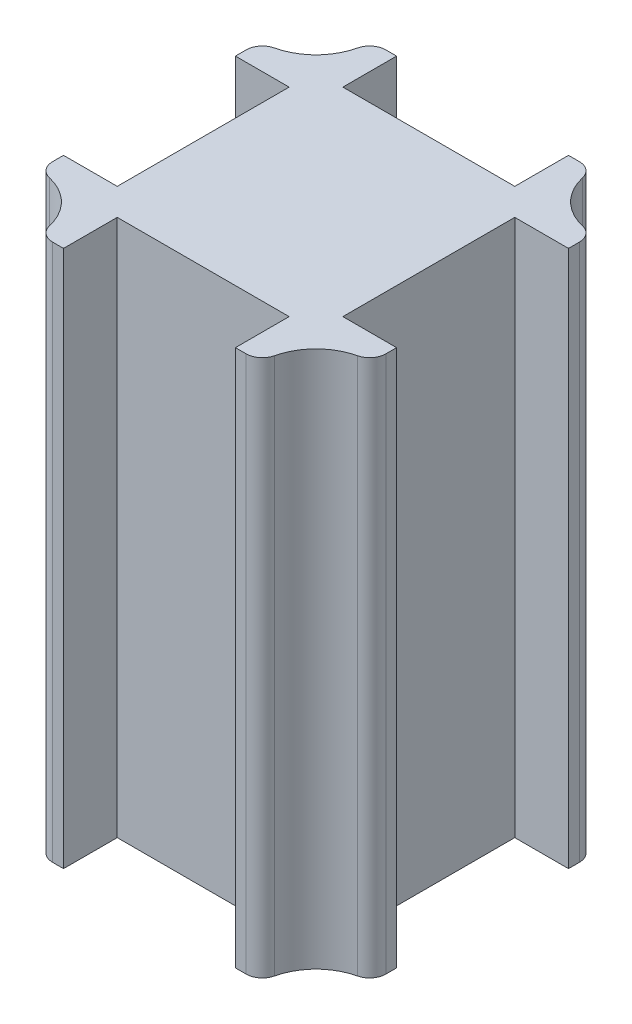
ISO-10303-21;
HEADER;
FILE_DESCRIPTION(('STEP AP214'),'2;1');
FILE_NAME('part.step','',(''),(''),'','','');
FILE_SCHEMA(('AUTOMOTIVE_DESIGN { 1 0 10303 214 1 1 1 1 }'));
ENDSEC;
DATA;
#1=APPLICATION_CONTEXT('core data for automotive mechanical design processes');
#2=APPLICATION_PROTOCOL_DEFINITION('international standard','automotive_design',2000,#1);
#3=PRODUCT_CONTEXT('',#1,'mechanical');
#4=PRODUCT('Part','Part','',(#3));
#5=PRODUCT_RELATED_PRODUCT_CATEGORY('part','',(#4));
#6=PRODUCT_DEFINITION_FORMATION('','',#4);
#7=PRODUCT_DEFINITION_CONTEXT('part definition',#1,'design');
#8=PRODUCT_DEFINITION('design','',#6,#7);
#9=PRODUCT_DEFINITION_SHAPE('','',#8);
#10=(LENGTH_UNIT() NAMED_UNIT(*) SI_UNIT(.MILLI.,.METRE.));
#11=(NAMED_UNIT(*) PLANE_ANGLE_UNIT() SI_UNIT($,.RADIAN.));
#12=(NAMED_UNIT(*) SI_UNIT($,.STERADIAN.) SOLID_ANGLE_UNIT());
#13=UNCERTAINTY_MEASURE_WITH_UNIT(LENGTH_MEASURE(1.E-05),#10,'distance_accuracy_value','');
#14=(GEOMETRIC_REPRESENTATION_CONTEXT(3) GLOBAL_UNCERTAINTY_ASSIGNED_CONTEXT((#13)) GLOBAL_UNIT_ASSIGNED_CONTEXT((#10,
#11,#12)) REPRESENTATION_CONTEXT('',''));
#15=CARTESIAN_POINT('',(0.,0.,0.));
#16=DIRECTION('',(0.,0.,1.));
#17=DIRECTION('',(1.,0.,0.));
#18=AXIS2_PLACEMENT_3D('',#15,#16,#17);
#19=CARTESIAN_POINT('',(15.5,53.,-15.5));
#20=DIRECTION('',(-1.,0.,0.));
#21=DIRECTION('',(0.,0.,1.));
#22=AXIS2_PLACEMENT_3D('',#19,#20,#21);
#23=PLANE('',#22);
#24=DIRECTION('',(0.,0.,-1.));
#25=VECTOR('',#24,1.);
#26=CARTESIAN_POINT('',(15.5,3.,-15.5));
#27=LINE('',#26,#25);
#28=CARTESIAN_POINT('',(15.5,3.,-8.00000000000019));
#29=VERTEX_POINT('',#28);
#30=CARTESIAN_POINT('',(15.5,3.,-9.00690631761515));
#31=VERTEX_POINT('',#30);
#32=EDGE_CURVE('E373',#29,#31,#27,.T.);
#33=ORIENTED_EDGE('',*,*,#32,.T.);
#34=DIRECTION('',(0.,1.,0.));
#35=VECTOR('',#34,1.);
#36=CARTESIAN_POINT('',(15.5,53.,-9.00690631761515));
#37=LINE('',#36,#35);
#38=CARTESIAN_POINT('',(15.5,53.,-9.00690631761515));
#39=VERTEX_POINT('',#38);
#40=EDGE_CURVE('E448',#31,#39,#37,.T.);
#41=ORIENTED_EDGE('',*,*,#40,.T.);
#42=DIRECTION('',(0.,0.,-1.));
#43=VECTOR('',#42,1.);
#44=CARTESIAN_POINT('',(15.5,53.,-15.5));
#45=LINE('',#44,#43);
#46=CARTESIAN_POINT('',(15.5,53.,-8.00000000000019));
#47=VERTEX_POINT('',#46);
#48=EDGE_CURVE('E259',#47,#39,#45,.T.);
#49=ORIENTED_EDGE('',*,*,#48,.F.);
#50=DIRECTION('',(0.,1.,0.));
#51=VECTOR('',#50,1.);
#52=CARTESIAN_POINT('',(15.5,3.,-8.00000000000019));
#53=LINE('',#52,#51);
#54=EDGE_CURVE('E325',#29,#47,#53,.T.);
#55=ORIENTED_EDGE('',*,*,#54,.F.);
#56=EDGE_LOOP('',(#33,#41,#49,#55));
#57=FACE_BOUND('',#56,.T.);
#58=ADVANCED_FACE('F39',(#57),#23,.F.);
#59=CARTESIAN_POINT('',(-15.5,53.,-15.5));
#60=DIRECTION('',(0.,0.,1.));
#61=DIRECTION('',(1.,0.,0.));
#62=AXIS2_PLACEMENT_3D('',#59,#60,#61);
#63=PLANE('',#62);
#64=DIRECTION('',(-1.,0.,0.));
#65=VECTOR('',#64,1.);
#66=CARTESIAN_POINT('',(-15.5,3.,-15.5));
#67=LINE('',#66,#65);
#68=CARTESIAN_POINT('',(-8.00000000000035,3.,-15.4999999999999));
#69=VERTEX_POINT('',#68);
#70=CARTESIAN_POINT('',(-9.00690631761527,3.,-15.5));
#71=VERTEX_POINT('',#70);
#72=EDGE_CURVE('E394',#69,#71,#67,.T.);
#73=ORIENTED_EDGE('',*,*,#72,.T.);
#74=DIRECTION('',(0.,1.,0.));
#75=VECTOR('',#74,1.);
#76=CARTESIAN_POINT('',(-9.00690631761527,53.,-15.5));
#77=LINE('',#76,#75);
#78=CARTESIAN_POINT('',(-9.00690631761527,53.,-15.5));
#79=VERTEX_POINT('',#78);
#80=EDGE_CURVE('E436',#71,#79,#77,.T.);
#81=ORIENTED_EDGE('',*,*,#80,.T.);
#82=DIRECTION('',(-1.,0.,0.));
#83=VECTOR('',#82,1.);
#84=CARTESIAN_POINT('',(-15.5,53.,-15.5));
#85=LINE('',#84,#83);
#86=CARTESIAN_POINT('',(-8.00000000000035,53.,-15.4999999999999));
#87=VERTEX_POINT('',#86);
#88=EDGE_CURVE('E385',#87,#79,#85,.T.);
#89=ORIENTED_EDGE('',*,*,#88,.F.);
#90=DIRECTION('',(0.,1.,0.));
#91=VECTOR('',#90,1.);
#92=CARTESIAN_POINT('',(-8.00000000000035,3.,-15.4999999999999));
#93=LINE('',#92,#91);
#94=EDGE_CURVE('E349',#69,#87,#93,.T.);
#95=ORIENTED_EDGE('',*,*,#94,.F.);
#96=EDGE_LOOP('',(#73,#81,#89,#95));
#97=FACE_BOUND('',#96,.T.);
#98=ADVANCED_FACE('F550',(#97),#63,.F.);
#99=CARTESIAN_POINT('',(-15.5,53.,15.5));
#100=DIRECTION('',(0.,0.,-1.));
#101=DIRECTION('',(-1.,0.,0.));
#102=AXIS2_PLACEMENT_3D('',#99,#100,#101);
#103=PLANE('',#102);
#104=DIRECTION('',(1.,0.,0.));
#105=VECTOR('',#104,1.);
#106=CARTESIAN_POINT('',(-15.5,3.,15.5));
#107=LINE('',#106,#105);
#108=CARTESIAN_POINT('',(8.00000000000024,3.,15.5));
#109=VERTEX_POINT('',#108);
#110=CARTESIAN_POINT('',(9.00690631761519,3.,15.5));
#111=VERTEX_POINT('',#110);
#112=EDGE_CURVE('E257',#109,#111,#107,.T.);
#113=ORIENTED_EDGE('',*,*,#112,.T.);
#114=DIRECTION('',(0.,1.,0.));
#115=VECTOR('',#114,1.);
#116=CARTESIAN_POINT('',(9.00690631761519,53.,15.5));
#117=LINE('',#116,#115);
#118=CARTESIAN_POINT('',(9.00690631761519,53.,15.5));
#119=VERTEX_POINT('',#118);
#120=EDGE_CURVE('E457',#111,#119,#117,.T.);
#121=ORIENTED_EDGE('',*,*,#120,.T.);
#122=DIRECTION('',(1.,0.,0.));
#123=VECTOR('',#122,1.);
#124=CARTESIAN_POINT('',(-15.5,53.,15.5));
#125=LINE('',#124,#123);
#126=CARTESIAN_POINT('',(8.00000000000024,53.,15.5));
#127=VERTEX_POINT('',#126);
#128=EDGE_CURVE('E389',#127,#119,#125,.T.);
#129=ORIENTED_EDGE('',*,*,#128,.F.);
#130=DIRECTION('',(0.,1.,0.));
#131=VECTOR('',#130,1.);
#132=CARTESIAN_POINT('',(8.00000000000024,3.,15.5));
#133=LINE('',#132,#131);
#134=EDGE_CURVE('E267',#109,#127,#133,.T.);
#135=ORIENTED_EDGE('',*,*,#134,.F.);
#136=EDGE_LOOP('',(#113,#121,#129,#135));
#137=FACE_BOUND('',#136,.T.);
#138=ADVANCED_FACE('F553',(#137),#103,.F.);
#139=CARTESIAN_POINT('',(-15.5,53.,-15.5));
#140=DIRECTION('',(1.,0.,0.));
#141=DIRECTION('',(0.,0.,-1.));
#142=AXIS2_PLACEMENT_3D('',#139,#140,#141);
#143=PLANE('',#142);
#144=DIRECTION('',(0.,0.,1.));
#145=VECTOR('',#144,1.);
#146=CARTESIAN_POINT('',(-15.5,3.,-15.5));
#147=LINE('',#146,#145);
#148=CARTESIAN_POINT('',(-15.5,3.,8.00000000000019));
#149=VERTEX_POINT('',#148);
#150=CARTESIAN_POINT('',(-15.5,3.,9.00690631761515));
#151=VERTEX_POINT('',#150);
#152=EDGE_CURVE('E399',#149,#151,#147,.T.);
#153=ORIENTED_EDGE('',*,*,#152,.T.);
#154=DIRECTION('',(0.,1.,0.));
#155=VECTOR('',#154,1.);
#156=CARTESIAN_POINT('',(-15.5,53.,9.00690631761515));
#157=LINE('',#156,#155);
#158=CARTESIAN_POINT('',(-15.5,53.,9.00690631761515));
#159=VERTEX_POINT('',#158);
#160=EDGE_CURVE('E11',#151,#159,#157,.T.);
#161=ORIENTED_EDGE('',*,*,#160,.T.);
#162=DIRECTION('',(0.,0.,1.));
#163=VECTOR('',#162,1.);
#164=CARTESIAN_POINT('',(-15.5,53.,-15.5));
#165=LINE('',#164,#163);
#166=CARTESIAN_POINT('',(-15.5,53.,8.00000000000019));
#167=VERTEX_POINT('',#166);
#168=EDGE_CURVE('E384',#167,#159,#165,.T.);
#169=ORIENTED_EDGE('',*,*,#168,.F.);
#170=DIRECTION('',(0.,1.,0.));
#171=VECTOR('',#170,1.);
#172=CARTESIAN_POINT('',(-15.5,3.,8.00000000000019));
#173=LINE('',#172,#171);
#174=EDGE_CURVE('E376',#149,#167,#173,.T.);
#175=ORIENTED_EDGE('',*,*,#174,.F.);
#176=EDGE_LOOP('',(#153,#161,#169,#175));
#177=FACE_BOUND('',#176,.T.);
#178=ADVANCED_FACE('F477',(#177),#143,.F.);
#179=CARTESIAN_POINT('',(15.5,53.,9.00690631761511));
#180=VERTEX_POINT('',#179);
#181=CARTESIAN_POINT('',(15.5,53.,8.));
#182=VERTEX_POINT('',#181);
#183=EDGE_CURVE('E379',#180,#182,#45,.T.);
#184=ORIENTED_EDGE('',*,*,#183,.F.);
#185=DIRECTION('',(0.,1.,0.));
#186=VECTOR('',#185,1.);
#187=CARTESIAN_POINT('',(15.5,53.,9.00690631761511));
#188=LINE('',#187,#186);
#189=CARTESIAN_POINT('',(15.5,3.,9.00690631761511));
#190=VERTEX_POINT('',#189);
#191=EDGE_CURVE('E449',#180,#190,#188,.F.);
#192=ORIENTED_EDGE('',*,*,#191,.T.);
#193=CARTESIAN_POINT('',(15.5,3.,8.));
#194=VERTEX_POINT('',#193);
#195=EDGE_CURVE('E395',#190,#194,#27,.T.);
#196=ORIENTED_EDGE('',*,*,#195,.T.);
#197=DIRECTION('',(0.,1.,0.));
#198=VECTOR('',#197,1.);
#199=CARTESIAN_POINT('',(15.5,3.,8.));
#200=LINE('',#199,#198);
#201=EDGE_CURVE('E310',#194,#182,#200,.T.);
#202=ORIENTED_EDGE('',*,*,#201,.T.);
#203=EDGE_LOOP('',(#184,#192,#196,#202));
#204=FACE_BOUND('',#203,.T.);
#205=ADVANCED_FACE('F549',(#204),#23,.F.);
#206=CARTESIAN_POINT('',(9.00690631761515,53.,-15.5));
#207=VERTEX_POINT('',#206);
#208=CARTESIAN_POINT('',(7.99999999999984,53.,-15.5000000000001));
#209=VERTEX_POINT('',#208);
#210=EDGE_CURVE('E382',#207,#209,#85,.T.);
#211=ORIENTED_EDGE('',*,*,#210,.F.);
#212=DIRECTION('',(0.,1.,0.));
#213=VECTOR('',#212,1.);
#214=CARTESIAN_POINT('',(9.00690631761515,53.,-15.5));
#215=LINE('',#214,#213);
#216=CARTESIAN_POINT('',(9.00690631761515,3.,-15.5));
#217=VERTEX_POINT('',#216);
#218=EDGE_CURVE('E438',#207,#217,#215,.F.);
#219=ORIENTED_EDGE('',*,*,#218,.T.);
#220=CARTESIAN_POINT('',(7.99999999999984,3.,-15.5000000000001));
#221=VERTEX_POINT('',#220);
#222=EDGE_CURVE('E392',#217,#221,#67,.T.);
#223=ORIENTED_EDGE('',*,*,#222,.T.);
#224=DIRECTION('',(0.,1.,0.));
#225=VECTOR('',#224,1.);
#226=CARTESIAN_POINT('',(7.99999999999984,3.,-15.5000000000001));
#227=LINE('',#226,#225);
#228=EDGE_CURVE('E338',#221,#209,#227,.T.);
#229=ORIENTED_EDGE('',*,*,#228,.T.);
#230=EDGE_LOOP('',(#211,#219,#223,#229));
#231=FACE_BOUND('',#230,.T.);
#232=ADVANCED_FACE('F556',(#231),#63,.F.);
#233=CARTESIAN_POINT('',(-15.5,53.,-9.00690631761502));
#234=VERTEX_POINT('',#233);
#235=CARTESIAN_POINT('',(-15.5,53.,-8.));
#236=VERTEX_POINT('',#235);
#237=EDGE_CURVE('E387',#234,#236,#165,.T.);
#238=ORIENTED_EDGE('',*,*,#237,.F.);
#239=DIRECTION('',(0.,1.,0.));
#240=VECTOR('',#239,1.);
#241=CARTESIAN_POINT('',(-15.5,53.,-9.00690631761502));
#242=LINE('',#241,#240);
#243=CARTESIAN_POINT('',(-15.5,3.,-9.00690631761502));
#244=VERTEX_POINT('',#243);
#245=EDGE_CURVE('E393',#234,#244,#242,.F.);
#246=ORIENTED_EDGE('',*,*,#245,.T.);
#247=CARTESIAN_POINT('',(-15.5,3.,-8.));
#248=VERTEX_POINT('',#247);
#249=EDGE_CURVE('E400',#244,#248,#147,.T.);
#250=ORIENTED_EDGE('',*,*,#249,.T.);
#251=DIRECTION('',(0.,1.,0.));
#252=VECTOR('',#251,1.);
#253=CARTESIAN_POINT('',(-15.5,3.,-8.));
#254=LINE('',#253,#252);
#255=EDGE_CURVE('E361',#248,#236,#254,.T.);
#256=ORIENTED_EDGE('',*,*,#255,.T.);
#257=EDGE_LOOP('',(#238,#246,#250,#256));
#258=FACE_BOUND('',#257,.T.);
#259=ADVANCED_FACE('F497',(#258),#143,.F.);
#260=CARTESIAN_POINT('',(-9.00690631761515,53.,15.5));
#261=VERTEX_POINT('',#260);
#262=CARTESIAN_POINT('',(-7.99999999999995,53.,15.5));
#263=VERTEX_POINT('',#262);
#264=EDGE_CURVE('E386',#261,#263,#125,.T.);
#265=ORIENTED_EDGE('',*,*,#264,.F.);
#266=DIRECTION('',(0.,1.,0.));
#267=VECTOR('',#266,1.);
#268=CARTESIAN_POINT('',(-9.00690631761515,53.,15.5));
#269=LINE('',#268,#267);
#270=CARTESIAN_POINT('',(-9.00690631761515,3.,15.5));
#271=VERTEX_POINT('',#270);
#272=EDGE_CURVE('E258',#261,#271,#269,.F.);
#273=ORIENTED_EDGE('',*,*,#272,.T.);
#274=CARTESIAN_POINT('',(-7.99999999999995,3.,15.5));
#275=VERTEX_POINT('',#274);
#276=EDGE_CURVE('E253',#271,#275,#107,.T.);
#277=ORIENTED_EDGE('',*,*,#276,.T.);
#278=DIRECTION('',(0.,1.,0.));
#279=VECTOR('',#278,1.);
#280=CARTESIAN_POINT('',(-7.99999999999995,3.,15.5));
#281=LINE('',#280,#279);
#282=EDGE_CURVE('E255',#275,#263,#281,.T.);
#283=ORIENTED_EDGE('',*,*,#282,.T.);
#284=EDGE_LOOP('',(#265,#273,#277,#283));
#285=FACE_BOUND('',#284,.T.);
#286=ADVANCED_FACE('F251',(#285),#103,.F.);
#287=CARTESIAN_POINT('',(0.,53.,0.));
#288=DIRECTION('',(0.,1.,0.));
#289=DIRECTION('',(0.,0.,1.));
#290=AXIS2_PLACEMENT_3D('',#287,#288,#289);
#291=PLANE('',#290);
#292=CARTESIAN_POINT('',(-15.5000000000002,53.,-15.4999999999998));
#293=DIRECTION('',(0.,1.,0.));
#294=DIRECTION('',(-1.,0.,0.));
#295=AXIS2_PLACEMENT_3D('',#292,#293,#294);
#296=CIRCLE('',#295,5.16410275792819);
#297=CARTESIAN_POINT('',(-14.3376298478176,53.,-10.4684144721809));
#298=VERTEX_POINT('',#297);
#299=CARTESIAN_POINT('',(-10.4684144721812,53.,-14.3376298478175));
#300=VERTEX_POINT('',#299);
#301=EDGE_CURVE('E506',#298,#300,#296,.T.);
#302=ORIENTED_EDGE('',*,*,#301,.F.);
#303=CARTESIAN_POINT('',(-14.,53.,-9.00690631761502));
#304=DIRECTION('',(0.,1.,0.));
#305=DIRECTION('',(0.,0.,1.));
#306=AXIS2_PLACEMENT_3D('',#303,#304,#305);
#307=CIRCLE('',#306,1.5);
#308=EDGE_CURVE('E432',#298,#234,#307,.T.);
#309=ORIENTED_EDGE('',*,*,#308,.T.);
#310=ORIENTED_EDGE('',*,*,#237,.T.);
#311=DIRECTION('',(-1.,0.,0.));
#312=VECTOR('',#311,1.);
#313=CARTESIAN_POINT('',(-15.5,53.,-8.));
#314=LINE('',#313,#312);
#315=CARTESIAN_POINT('',(-10.5000000000001,53.,-8.));
#316=VERTEX_POINT('',#315);
#317=EDGE_CURVE('E293',#316,#236,#314,.T.);
#318=ORIENTED_EDGE('',*,*,#317,.F.);
#319=DIRECTION('',(0.,0.,-1.));
#320=VECTOR('',#319,1.);
#321=CARTESIAN_POINT('',(-10.5000000000001,53.,-8.));
#322=LINE('',#321,#320);
#323=CARTESIAN_POINT('',(-10.5000000000001,53.,8.00000000000019));
#324=VERTEX_POINT('',#323);
#325=EDGE_CURVE('E359',#324,#316,#322,.T.);
#326=ORIENTED_EDGE('',*,*,#325,.F.);
#327=DIRECTION('',(1.,0.,0.));
#328=VECTOR('',#327,1.);
#329=CARTESIAN_POINT('',(-10.5000000000001,53.,8.00000000000019));
#330=LINE('',#329,#328);
#331=EDGE_CURVE('E368',#167,#324,#330,.T.);
#332=ORIENTED_EDGE('',*,*,#331,.F.);
#333=ORIENTED_EDGE('',*,*,#168,.T.);
#334=CARTESIAN_POINT('',(-14.,53.,9.00690631761515));
#335=DIRECTION('',(0.,1.,0.));
#336=DIRECTION('',(0.,0.,1.));
#337=AXIS2_PLACEMENT_3D('',#334,#335,#336);
#338=CIRCLE('',#337,1.5);
#339=CARTESIAN_POINT('',(-14.3376298478176,53.,10.4684144721811));
#340=VERTEX_POINT('',#339);
#341=EDGE_CURVE('E425',#159,#340,#338,.T.);
#342=ORIENTED_EDGE('',*,*,#341,.T.);
#343=CARTESIAN_POINT('',(-15.5,53.,15.5));
#344=DIRECTION('',(0.,1.,0.));
#345=DIRECTION('',(0.,0.,1.));
#346=AXIS2_PLACEMENT_3D('',#343,#344,#345);
#347=CIRCLE('',#346,5.16410275792819);
#348=CARTESIAN_POINT('',(-10.4684144721811,53.,14.3376298478176));
#349=VERTEX_POINT('',#348);
#350=EDGE_CURVE('E282',#349,#340,#347,.T.);
#351=ORIENTED_EDGE('',*,*,#350,.F.);
#352=CARTESIAN_POINT('',(-9.00690631761515,53.,14.));
#353=DIRECTION('',(0.,1.,0.));
#354=DIRECTION('',(0.,0.,1.));
#355=AXIS2_PLACEMENT_3D('',#352,#353,#354);
#356=CIRCLE('',#355,1.5);
#357=EDGE_CURVE('E65',#349,#261,#356,.T.);
#358=ORIENTED_EDGE('',*,*,#357,.T.);
#359=ORIENTED_EDGE('',*,*,#264,.T.);
#360=DIRECTION('',(0.,0.,1.));
#361=VECTOR('',#360,1.);
#362=CARTESIAN_POINT('',(-7.99999999999995,53.,15.5));
#363=LINE('',#362,#361);
#364=CARTESIAN_POINT('',(-7.99999999999996,53.,10.5000000000001));
#365=VERTEX_POINT('',#364);
#366=EDGE_CURVE('E268',#365,#263,#363,.T.);
#367=ORIENTED_EDGE('',*,*,#366,.F.);
#368=DIRECTION('',(-1.,0.,0.));
#369=VECTOR('',#368,1.);
#370=CARTESIAN_POINT('',(-7.99999999999996,53.,10.5000000000001));
#371=LINE('',#370,#369);
#372=CARTESIAN_POINT('',(8.00000000000022,53.,10.5000000000001));
#373=VERTEX_POINT('',#372);
#374=EDGE_CURVE('E279',#373,#365,#371,.T.);
#375=ORIENTED_EDGE('',*,*,#374,.F.);
#376=DIRECTION('',(0.,0.,-1.));
#377=VECTOR('',#376,1.);
#378=CARTESIAN_POINT('',(8.00000000000022,53.,10.5000000000001));
#379=LINE('',#378,#377);
#380=EDGE_CURVE('E285',#127,#373,#379,.T.);
#381=ORIENTED_EDGE('',*,*,#380,.F.);
#382=ORIENTED_EDGE('',*,*,#128,.T.);
#383=CARTESIAN_POINT('',(9.00690631761519,53.,14.));
#384=DIRECTION('',(0.,1.,0.));
#385=DIRECTION('',(0.,0.,1.));
#386=AXIS2_PLACEMENT_3D('',#383,#384,#385);
#387=CIRCLE('',#386,1.5);
#388=CARTESIAN_POINT('',(10.4684144721811,53.,14.3376298478176));
#389=VERTEX_POINT('',#388);
#390=EDGE_CURVE('E53',#119,#389,#387,.T.);
#391=ORIENTED_EDGE('',*,*,#390,.T.);
#392=CARTESIAN_POINT('',(15.5000000000001,53.,15.4999999999999));
#393=DIRECTION('',(0.,1.,0.));
#394=DIRECTION('',(1.,0.,0.));
#395=AXIS2_PLACEMENT_3D('',#392,#393,#394);
#396=CIRCLE('',#395,5.16410275792819);
#397=CARTESIAN_POINT('',(14.3376298478176,53.,10.468414472181));
#398=VERTEX_POINT('',#397);
#399=EDGE_CURVE('E523',#398,#389,#396,.T.);
#400=ORIENTED_EDGE('',*,*,#399,.F.);
#401=CARTESIAN_POINT('',(14.,53.,9.00690631761511));
#402=DIRECTION('',(0.,1.,0.));
#403=DIRECTION('',(0.,0.,1.));
#404=AXIS2_PLACEMENT_3D('',#401,#402,#403);
#405=CIRCLE('',#404,1.5);
#406=EDGE_CURVE('E426',#398,#180,#405,.T.);
#407=ORIENTED_EDGE('',*,*,#406,.T.);
#408=ORIENTED_EDGE('',*,*,#183,.T.);
#409=DIRECTION('',(1.,0.,0.));
#410=VECTOR('',#409,1.);
#411=CARTESIAN_POINT('',(15.5,53.,8.));
#412=LINE('',#411,#410);
#413=CARTESIAN_POINT('',(10.5000000000001,53.,8.));
#414=VERTEX_POINT('',#413);
#415=EDGE_CURVE('E309',#414,#182,#412,.T.);
#416=ORIENTED_EDGE('',*,*,#415,.F.);
#417=DIRECTION('',(0.,0.,1.));
#418=VECTOR('',#417,1.);
#419=CARTESIAN_POINT('',(10.5000000000001,53.,8.));
#420=LINE('',#419,#418);
#421=CARTESIAN_POINT('',(10.5000000000001,53.,-8.00000000000019));
#422=VERTEX_POINT('',#421);
#423=EDGE_CURVE('E305',#422,#414,#420,.T.);
#424=ORIENTED_EDGE('',*,*,#423,.F.);
#425=DIRECTION('',(-1.,0.,0.));
#426=VECTOR('',#425,1.);
#427=CARTESIAN_POINT('',(10.5000000000001,53.,-8.00000000000019));
#428=LINE('',#427,#426);
#429=EDGE_CURVE('E311',#47,#422,#428,.T.);
#430=ORIENTED_EDGE('',*,*,#429,.F.);
#431=ORIENTED_EDGE('',*,*,#48,.T.);
#432=CARTESIAN_POINT('',(14.,53.,-9.00690631761515));
#433=DIRECTION('',(0.,1.,0.));
#434=DIRECTION('',(0.,0.,1.));
#435=AXIS2_PLACEMENT_3D('',#432,#433,#434);
#436=CIRCLE('',#435,1.5);
#437=CARTESIAN_POINT('',(14.3376298478176,53.,-10.4684144721811));
#438=VERTEX_POINT('',#437);
#439=EDGE_CURVE('E428',#39,#438,#436,.T.);
#440=ORIENTED_EDGE('',*,*,#439,.T.);
#441=CARTESIAN_POINT('',(15.5,53.,-15.5));
#442=DIRECTION('',(0.,1.,0.));
#443=DIRECTION('',(0.,0.,-1.));
#444=AXIS2_PLACEMENT_3D('',#441,#442,#443);
#445=CIRCLE('',#444,5.16410275792819);
#446=CARTESIAN_POINT('',(10.4684144721811,53.,-14.3376298478176));
#447=VERTEX_POINT('',#446);
#448=EDGE_CURVE('E510',#447,#438,#445,.T.);
#449=ORIENTED_EDGE('',*,*,#448,.F.);
#450=CARTESIAN_POINT('',(9.00690631761515,53.,-14.));
#451=DIRECTION('',(0.,1.,0.));
#452=DIRECTION('',(0.,0.,1.));
#453=AXIS2_PLACEMENT_3D('',#450,#451,#452);
#454=CIRCLE('',#453,1.5);
#455=EDGE_CURVE('E429',#447,#207,#454,.T.);
#456=ORIENTED_EDGE('',*,*,#455,.T.);
#457=ORIENTED_EDGE('',*,*,#210,.T.);
#458=DIRECTION('',(0.,0.,-1.));
#459=VECTOR('',#458,1.);
#460=CARTESIAN_POINT('',(7.99999999999984,53.,-15.5000000000001));
#461=LINE('',#460,#459);
#462=CARTESIAN_POINT('',(7.99999999999989,53.,-10.5000000000002));
#463=VERTEX_POINT('',#462);
#464=EDGE_CURVE('E340',#463,#209,#461,.T.);
#465=ORIENTED_EDGE('',*,*,#464,.F.);
#466=DIRECTION('',(1.,0.,0.));
#467=VECTOR('',#466,1.);
#468=CARTESIAN_POINT('',(7.99999999999989,53.,-10.5000000000002));
#469=LINE('',#468,#467);
#470=CARTESIAN_POINT('',(-8.00000000000029,53.,-10.5));
#471=VERTEX_POINT('',#470);
#472=EDGE_CURVE('E329',#471,#463,#469,.T.);
#473=ORIENTED_EDGE('',*,*,#472,.F.);
#474=DIRECTION('',(0.,0.,1.));
#475=VECTOR('',#474,1.);
#476=CARTESIAN_POINT('',(-8.00000000000029,53.,-10.5));
#477=LINE('',#476,#475);
#478=EDGE_CURVE('E337',#87,#471,#477,.T.);
#479=ORIENTED_EDGE('',*,*,#478,.F.);
#480=ORIENTED_EDGE('',*,*,#88,.T.);
#481=CARTESIAN_POINT('',(-9.00690631761527,53.,-14.));
#482=DIRECTION('',(0.,1.,0.));
#483=DIRECTION('',(0.,0.,1.));
#484=AXIS2_PLACEMENT_3D('',#481,#482,#483);
#485=CIRCLE('',#484,1.5);
#486=EDGE_CURVE('E435',#79,#300,#485,.T.);
#487=ORIENTED_EDGE('',*,*,#486,.T.);
#488=EDGE_LOOP('',(#302,#309,#310,#318,#326,#332,#333,#342,#351,#358,#359,#367,#375,#381,#382,
#391,#400,#407,#408,#416,#424,#430,#431,#440,#449,#456,#457,#465,#473,#479,#480,#487));
#489=FACE_BOUND('',#488,.T.);
#490=ADVANCED_FACE('F466',(#489),#291,.T.);
#491=CARTESIAN_POINT('',(0.,3.,0.));
#492=DIRECTION('',(0.,1.,0.));
#493=DIRECTION('',(0.,0.,1.));
#494=AXIS2_PLACEMENT_3D('',#491,#492,#493);
#495=PLANE('',#494);
#496=CARTESIAN_POINT('',(0.,3.,0.));
#497=DIRECTION('',(0.,-1.,0.));
#498=DIRECTION('',(0.,0.,-1.));
#499=AXIS2_PLACEMENT_3D('',#496,#497,#498);
#500=CIRCLE('',#499,4.25);
#501=CARTESIAN_POINT('',(0.,3.,-4.25));
#502=VERTEX_POINT('',#501);
#503=EDGE_CURVE('E520',#502,#502,#500,.T.);
#504=ORIENTED_EDGE('',*,*,#503,.F.);
#505=EDGE_LOOP('',(#504));
#506=FACE_BOUND('',#505,.T.);
#507=ORIENTED_EDGE('',*,*,#249,.F.);
#508=CARTESIAN_POINT('',(-14.,3.,-9.00690631761502));
#509=DIRECTION('',(0.,1.,0.));
#510=DIRECTION('',(0.,0.,1.));
#511=AXIS2_PLACEMENT_3D('',#508,#509,#510);
#512=CIRCLE('',#511,1.5);
#513=CARTESIAN_POINT('',(-14.3376298478176,3.,-10.4684144721809));
#514=VERTEX_POINT('',#513);
#515=EDGE_CURVE('E418',#244,#514,#512,.F.);
#516=ORIENTED_EDGE('',*,*,#515,.T.);
#517=CARTESIAN_POINT('',(-15.5000000000002,3.,-15.4999999999998));
#518=DIRECTION('',(0.,1.,0.));
#519=DIRECTION('',(-1.,0.,0.));
#520=AXIS2_PLACEMENT_3D('',#517,#518,#519);
#521=CIRCLE('',#520,5.16410275792819);
#522=CARTESIAN_POINT('',(-10.4684144721812,3.,-14.3376298478175));
#523=VERTEX_POINT('',#522);
#524=EDGE_CURVE('E498',#514,#523,#521,.T.);
#525=ORIENTED_EDGE('',*,*,#524,.T.);
#526=CARTESIAN_POINT('',(-9.00690631761527,3.,-14.));
#527=DIRECTION('',(0.,1.,0.));
#528=DIRECTION('',(0.,0.,1.));
#529=AXIS2_PLACEMENT_3D('',#526,#527,#528);
#530=CIRCLE('',#529,1.5);
#531=EDGE_CURVE('E411',#523,#71,#530,.F.);
#532=ORIENTED_EDGE('',*,*,#531,.T.);
#533=ORIENTED_EDGE('',*,*,#72,.F.);
#534=DIRECTION('',(0.,0.,1.));
#535=VECTOR('',#534,1.);
#536=CARTESIAN_POINT('',(-8.00000000000029,3.,-10.5));
#537=LINE('',#536,#535);
#538=CARTESIAN_POINT('',(-8.00000000000029,3.,-10.5));
#539=VERTEX_POINT('',#538);
#540=EDGE_CURVE('E328',#69,#539,#537,.T.);
#541=ORIENTED_EDGE('',*,*,#540,.T.);
#542=DIRECTION('',(1.,0.,0.));
#543=VECTOR('',#542,1.);
#544=CARTESIAN_POINT('',(7.99999999999989,3.,-10.5000000000002));
#545=LINE('',#544,#543);
#546=CARTESIAN_POINT('',(7.99999999999989,3.,-10.5000000000002));
#547=VERTEX_POINT('',#546);
#548=EDGE_CURVE('E334',#539,#547,#545,.T.);
#549=ORIENTED_EDGE('',*,*,#548,.T.);
#550=DIRECTION('',(0.,0.,-1.));
#551=VECTOR('',#550,1.);
#552=CARTESIAN_POINT('',(7.99999999999984,3.,-15.5000000000001));
#553=LINE('',#552,#551);
#554=EDGE_CURVE('E326',#547,#221,#553,.T.);
#555=ORIENTED_EDGE('',*,*,#554,.T.);
#556=ORIENTED_EDGE('',*,*,#222,.F.);
#557=CARTESIAN_POINT('',(9.00690631761515,3.,-14.));
#558=DIRECTION('',(0.,1.,0.));
#559=DIRECTION('',(0.,0.,1.));
#560=AXIS2_PLACEMENT_3D('',#557,#558,#559);
#561=CIRCLE('',#560,1.5);
#562=CARTESIAN_POINT('',(10.4684144721811,3.,-14.3376298478176));
#563=VERTEX_POINT('',#562);
#564=EDGE_CURVE('E414',#217,#563,#561,.F.);
#565=ORIENTED_EDGE('',*,*,#564,.T.);
#566=CARTESIAN_POINT('',(15.5,3.,-15.5));
#567=DIRECTION('',(0.,1.,0.));
#568=DIRECTION('',(0.,0.,-1.));
#569=AXIS2_PLACEMENT_3D('',#566,#567,#568);
#570=CIRCLE('',#569,5.16410275792819);
#571=CARTESIAN_POINT('',(14.3376298478176,3.,-10.4684144721811));
#572=VERTEX_POINT('',#571);
#573=EDGE_CURVE('E524',#563,#572,#570,.T.);
#574=ORIENTED_EDGE('',*,*,#573,.T.);
#575=CARTESIAN_POINT('',(14.,3.,-9.00690631761515));
#576=DIRECTION('',(0.,1.,0.));
#577=DIRECTION('',(0.,0.,1.));
#578=AXIS2_PLACEMENT_3D('',#575,#576,#577);
#579=CIRCLE('',#578,1.5);
#580=EDGE_CURVE('E407',#572,#31,#579,.F.);
#581=ORIENTED_EDGE('',*,*,#580,.T.);
#582=ORIENTED_EDGE('',*,*,#32,.F.);
#583=DIRECTION('',(-1.,0.,0.));
#584=VECTOR('',#583,1.);
#585=CARTESIAN_POINT('',(10.5000000000001,3.,-8.00000000000019));
#586=LINE('',#585,#584);
#587=CARTESIAN_POINT('',(10.5000000000001,3.,-8.00000000000019));
#588=VERTEX_POINT('',#587);
#589=EDGE_CURVE('E304',#29,#588,#586,.T.);
#590=ORIENTED_EDGE('',*,*,#589,.T.);
#591=DIRECTION('',(0.,0.,1.));
#592=VECTOR('',#591,1.);
#593=CARTESIAN_POINT('',(10.5000000000001,3.,8.));
#594=LINE('',#593,#592);
#595=CARTESIAN_POINT('',(10.5000000000001,3.,8.));
#596=VERTEX_POINT('',#595);
#597=EDGE_CURVE('E308',#588,#596,#594,.T.);
#598=ORIENTED_EDGE('',*,*,#597,.T.);
#599=DIRECTION('',(1.,0.,0.));
#600=VECTOR('',#599,1.);
#601=CARTESIAN_POINT('',(15.5,3.,8.));
#602=LINE('',#601,#600);
#603=EDGE_CURVE('E299',#596,#194,#602,.T.);
#604=ORIENTED_EDGE('',*,*,#603,.T.);
#605=ORIENTED_EDGE('',*,*,#195,.F.);
#606=CARTESIAN_POINT('',(14.,3.,9.00690631761511));
#607=DIRECTION('',(0.,1.,0.));
#608=DIRECTION('',(0.,0.,1.));
#609=AXIS2_PLACEMENT_3D('',#606,#607,#608);
#610=CIRCLE('',#609,1.5);
#611=CARTESIAN_POINT('',(14.3376298478176,3.,10.468414472181));
#612=VERTEX_POINT('',#611);
#613=EDGE_CURVE('E406',#190,#612,#610,.F.);
#614=ORIENTED_EDGE('',*,*,#613,.T.);
#615=CARTESIAN_POINT('',(15.5000000000001,3.,15.4999999999999));
#616=DIRECTION('',(0.,1.,0.));
#617=DIRECTION('',(1.,0.,0.));
#618=AXIS2_PLACEMENT_3D('',#615,#616,#617);
#619=CIRCLE('',#618,5.16410275792819);
#620=CARTESIAN_POINT('',(10.4684144721811,3.,14.3376298478176));
#621=VERTEX_POINT('',#620);
#622=EDGE_CURVE('E473',#612,#621,#619,.T.);
#623=ORIENTED_EDGE('',*,*,#622,.T.);
#624=CARTESIAN_POINT('',(9.00690631761519,3.,14.));
#625=DIRECTION('',(0.,1.,0.));
#626=DIRECTION('',(0.,0.,1.));
#627=AXIS2_PLACEMENT_3D('',#624,#625,#626);
#628=CIRCLE('',#627,1.5);
#629=EDGE_CURVE('E408',#621,#111,#628,.F.);
#630=ORIENTED_EDGE('',*,*,#629,.T.);
#631=ORIENTED_EDGE('',*,*,#112,.F.);
#632=DIRECTION('',(0.,0.,-1.));
#633=VECTOR('',#632,1.);
#634=CARTESIAN_POINT('',(8.00000000000022,3.,10.5000000000001));
#635=LINE('',#634,#633);
#636=CARTESIAN_POINT('',(8.00000000000022,3.,10.5000000000001));
#637=VERTEX_POINT('',#636);
#638=EDGE_CURVE('E280',#109,#637,#635,.T.);
#639=ORIENTED_EDGE('',*,*,#638,.T.);
#640=DIRECTION('',(-1.,0.,0.));
#641=VECTOR('',#640,1.);
#642=CARTESIAN_POINT('',(-7.99999999999996,3.,10.5000000000001));
#643=LINE('',#642,#641);
#644=CARTESIAN_POINT('',(-7.99999999999996,3.,10.5000000000001));
#645=VERTEX_POINT('',#644);
#646=EDGE_CURVE('E269',#637,#645,#643,.T.);
#647=ORIENTED_EDGE('',*,*,#646,.T.);
#648=DIRECTION('',(0.,0.,1.));
#649=VECTOR('',#648,1.);
#650=CARTESIAN_POINT('',(-7.99999999999995,3.,15.5));
#651=LINE('',#650,#649);
#652=EDGE_CURVE('E264',#645,#275,#651,.T.);
#653=ORIENTED_EDGE('',*,*,#652,.T.);
#654=ORIENTED_EDGE('',*,*,#276,.F.);
#655=CARTESIAN_POINT('',(-9.00690631761515,3.,14.));
#656=DIRECTION('',(0.,1.,0.));
#657=DIRECTION('',(0.,0.,1.));
#658=AXIS2_PLACEMENT_3D('',#655,#656,#657);
#659=CIRCLE('',#658,1.5);
#660=CARTESIAN_POINT('',(-10.4684144721811,3.,14.3376298478176));
#661=VERTEX_POINT('',#660);
#662=EDGE_CURVE('E404',#271,#661,#659,.F.);
#663=ORIENTED_EDGE('',*,*,#662,.T.);
#664=CARTESIAN_POINT('',(-15.5,3.,15.5));
#665=DIRECTION('',(0.,1.,0.));
#666=DIRECTION('',(0.,0.,1.));
#667=AXIS2_PLACEMENT_3D('',#664,#665,#666);
#668=CIRCLE('',#667,5.16410275792819);
#669=CARTESIAN_POINT('',(-14.3376298478176,3.,10.4684144721811));
#670=VERTEX_POINT('',#669);
#671=EDGE_CURVE('E342',#661,#670,#668,.T.);
#672=ORIENTED_EDGE('',*,*,#671,.T.);
#673=CARTESIAN_POINT('',(-14.,3.,9.00690631761515));
#674=DIRECTION('',(0.,1.,0.));
#675=DIRECTION('',(0.,0.,1.));
#676=AXIS2_PLACEMENT_3D('',#673,#674,#675);
#677=CIRCLE('',#676,1.5);
#678=EDGE_CURVE('E405',#670,#151,#677,.F.);
#679=ORIENTED_EDGE('',*,*,#678,.T.);
#680=ORIENTED_EDGE('',*,*,#152,.F.);
#681=DIRECTION('',(1.,0.,0.));
#682=VECTOR('',#681,1.);
#683=CARTESIAN_POINT('',(-10.5000000000001,3.,8.00000000000019));
#684=LINE('',#683,#682);
#685=CARTESIAN_POINT('',(-10.5000000000001,3.,8.00000000000019));
#686=VERTEX_POINT('',#685);
#687=EDGE_CURVE('E357',#149,#686,#684,.T.);
#688=ORIENTED_EDGE('',*,*,#687,.T.);
#689=DIRECTION('',(0.,0.,-1.));
#690=VECTOR('',#689,1.);
#691=CARTESIAN_POINT('',(-10.5000000000001,3.,-8.));
#692=LINE('',#691,#690);
#693=CARTESIAN_POINT('',(-10.5000000000001,3.,-8.));
#694=VERTEX_POINT('',#693);
#695=EDGE_CURVE('E358',#686,#694,#692,.T.);
#696=ORIENTED_EDGE('',*,*,#695,.T.);
#697=DIRECTION('',(-1.,0.,0.));
#698=VECTOR('',#697,1.);
#699=CARTESIAN_POINT('',(-15.5,3.,-8.));
#700=LINE('',#699,#698);
#701=EDGE_CURVE('E351',#694,#248,#700,.T.);
#702=ORIENTED_EDGE('',*,*,#701,.T.);
#703=EDGE_LOOP('',(#507,#516,#525,#532,#533,#541,#549,#555,#556,#565,#574,#581,#582,#590,#598,
#604,#605,#614,#623,#630,#631,#639,#647,#653,#654,#663,#672,#679,#680,#688,#696,#702));
#704=FACE_BOUND('',#703,.T.);
#705=ADVANCED_FACE('F273',(#506,#704),#495,.F.);
#706=CARTESIAN_POINT('',(-15.5,3.,-8.));
#707=DIRECTION('',(0.,0.,-1.));
#708=DIRECTION('',(-1.,0.,0.));
#709=AXIS2_PLACEMENT_3D('',#706,#707,#708);
#710=PLANE('',#709);
#711=ORIENTED_EDGE('',*,*,#317,.T.);
#712=ORIENTED_EDGE('',*,*,#255,.F.);
#713=ORIENTED_EDGE('',*,*,#701,.F.);
#714=DIRECTION('',(0.,1.,0.));
#715=VECTOR('',#714,1.);
#716=CARTESIAN_POINT('',(-10.5000000000001,3.,-8.));
#717=LINE('',#716,#715);
#718=EDGE_CURVE('E371',#694,#316,#717,.T.);
#719=ORIENTED_EDGE('',*,*,#718,.T.);
#720=EDGE_LOOP('',(#711,#712,#713,#719));
#721=FACE_BOUND('',#720,.T.);
#722=ADVANCED_FACE('F495',(#721),#710,.F.);
#723=CARTESIAN_POINT('',(-10.5000000000001,3.,-8.));
#724=DIRECTION('',(1.,0.,0.));
#725=DIRECTION('',(0.,0.,-1.));
#726=AXIS2_PLACEMENT_3D('',#723,#724,#725);
#727=PLANE('',#726);
#728=ORIENTED_EDGE('',*,*,#325,.T.);
#729=ORIENTED_EDGE('',*,*,#718,.F.);
#730=ORIENTED_EDGE('',*,*,#695,.F.);
#731=DIRECTION('',(0.,1.,0.));
#732=VECTOR('',#731,1.);
#733=CARTESIAN_POINT('',(-10.5000000000001,3.,8.00000000000019));
#734=LINE('',#733,#732);
#735=EDGE_CURVE('E372',#686,#324,#734,.T.);
#736=ORIENTED_EDGE('',*,*,#735,.T.);
#737=EDGE_LOOP('',(#728,#729,#730,#736));
#738=FACE_BOUND('',#737,.T.);
#739=ADVANCED_FACE('F489',(#738),#727,.F.);
#740=CARTESIAN_POINT('',(-10.5000000000001,3.,8.00000000000019));
#741=DIRECTION('',(0.,0.,1.));
#742=DIRECTION('',(1.,0.,0.));
#743=AXIS2_PLACEMENT_3D('',#740,#741,#742);
#744=PLANE('',#743);
#745=ORIENTED_EDGE('',*,*,#331,.T.);
#746=ORIENTED_EDGE('',*,*,#735,.F.);
#747=ORIENTED_EDGE('',*,*,#687,.F.);
#748=ORIENTED_EDGE('',*,*,#174,.T.);
#749=EDGE_LOOP('',(#745,#746,#747,#748));
#750=FACE_BOUND('',#749,.T.);
#751=ADVANCED_FACE('F486',(#750),#744,.F.);
#752=CARTESIAN_POINT('',(7.99999999999984,3.,-15.5000000000001));
#753=DIRECTION('',(1.,0.,0.));
#754=DIRECTION('',(0.,0.,-1.));
#755=AXIS2_PLACEMENT_3D('',#752,#753,#754);
#756=PLANE('',#755);
#757=ORIENTED_EDGE('',*,*,#464,.T.);
#758=ORIENTED_EDGE('',*,*,#228,.F.);
#759=ORIENTED_EDGE('',*,*,#554,.F.);
#760=DIRECTION('',(0.,1.,0.));
#761=VECTOR('',#760,1.);
#762=CARTESIAN_POINT('',(7.99999999999989,3.,-10.5000000000002));
#763=LINE('',#762,#761);
#764=EDGE_CURVE('E314',#547,#463,#763,.T.);
#765=ORIENTED_EDGE('',*,*,#764,.T.);
#766=EDGE_LOOP('',(#757,#758,#759,#765));
#767=FACE_BOUND('',#766,.T.);
#768=ADVANCED_FACE('F625',(#767),#756,.F.);
#769=CARTESIAN_POINT('',(7.99999999999989,3.,-10.5000000000002));
#770=DIRECTION('',(0.,0.,1.));
#771=DIRECTION('',(1.,0.,0.));
#772=AXIS2_PLACEMENT_3D('',#769,#770,#771);
#773=PLANE('',#772);
#774=ORIENTED_EDGE('',*,*,#472,.T.);
#775=ORIENTED_EDGE('',*,*,#764,.F.);
#776=ORIENTED_EDGE('',*,*,#548,.F.);
#777=DIRECTION('',(0.,1.,0.));
#778=VECTOR('',#777,1.);
#779=CARTESIAN_POINT('',(-8.00000000000029,3.,-10.5));
#780=LINE('',#779,#778);
#781=EDGE_CURVE('E350',#539,#471,#780,.T.);
#782=ORIENTED_EDGE('',*,*,#781,.T.);
#783=EDGE_LOOP('',(#774,#775,#776,#782));
#784=FACE_BOUND('',#783,.T.);
#785=ADVANCED_FACE('F616',(#784),#773,.F.);
#786=CARTESIAN_POINT('',(-8.00000000000029,3.,-10.5));
#787=DIRECTION('',(-1.,0.,0.));
#788=DIRECTION('',(0.,0.,1.));
#789=AXIS2_PLACEMENT_3D('',#786,#787,#788);
#790=PLANE('',#789);
#791=ORIENTED_EDGE('',*,*,#478,.T.);
#792=ORIENTED_EDGE('',*,*,#781,.F.);
#793=ORIENTED_EDGE('',*,*,#540,.F.);
#794=ORIENTED_EDGE('',*,*,#94,.T.);
#795=EDGE_LOOP('',(#791,#792,#793,#794));
#796=FACE_BOUND('',#795,.T.);
#797=ADVANCED_FACE('F619',(#796),#790,.F.);
#798=CARTESIAN_POINT('',(15.5,3.,8.));
#799=DIRECTION('',(0.,0.,1.));
#800=DIRECTION('',(1.,0.,0.));
#801=AXIS2_PLACEMENT_3D('',#798,#799,#800);
#802=PLANE('',#801);
#803=ORIENTED_EDGE('',*,*,#415,.T.);
#804=ORIENTED_EDGE('',*,*,#201,.F.);
#805=ORIENTED_EDGE('',*,*,#603,.F.);
#806=DIRECTION('',(0.,1.,0.));
#807=VECTOR('',#806,1.);
#808=CARTESIAN_POINT('',(10.5000000000001,3.,8.));
#809=LINE('',#808,#807);
#810=EDGE_CURVE('E288',#596,#414,#809,.T.);
#811=ORIENTED_EDGE('',*,*,#810,.T.);
#812=EDGE_LOOP('',(#803,#804,#805,#811));
#813=FACE_BOUND('',#812,.T.);
#814=ADVANCED_FACE('F608',(#813),#802,.F.);
#815=CARTESIAN_POINT('',(10.5000000000001,3.,8.));
#816=DIRECTION('',(-1.,0.,0.));
#817=DIRECTION('',(0.,0.,1.));
#818=AXIS2_PLACEMENT_3D('',#815,#816,#817);
#819=PLANE('',#818);
#820=ORIENTED_EDGE('',*,*,#423,.T.);
#821=ORIENTED_EDGE('',*,*,#810,.F.);
#822=ORIENTED_EDGE('',*,*,#597,.F.);
#823=DIRECTION('',(0.,1.,0.));
#824=VECTOR('',#823,1.);
#825=CARTESIAN_POINT('',(10.5000000000001,3.,-8.00000000000019));
#826=LINE('',#825,#824);
#827=EDGE_CURVE('E319',#588,#422,#826,.T.);
#828=ORIENTED_EDGE('',*,*,#827,.T.);
#829=EDGE_LOOP('',(#820,#821,#822,#828));
#830=FACE_BOUND('',#829,.T.);
#831=ADVANCED_FACE('F610',(#830),#819,.F.);
#832=CARTESIAN_POINT('',(10.5000000000001,3.,-8.00000000000019));
#833=DIRECTION('',(0.,0.,-1.));
#834=DIRECTION('',(-1.,0.,0.));
#835=AXIS2_PLACEMENT_3D('',#832,#833,#834);
#836=PLANE('',#835);
#837=ORIENTED_EDGE('',*,*,#429,.T.);
#838=ORIENTED_EDGE('',*,*,#827,.F.);
#839=ORIENTED_EDGE('',*,*,#589,.F.);
#840=ORIENTED_EDGE('',*,*,#54,.T.);
#841=EDGE_LOOP('',(#837,#838,#839,#840));
#842=FACE_BOUND('',#841,.T.);
#843=ADVANCED_FACE('F605',(#842),#836,.F.);
#844=CARTESIAN_POINT('',(-7.99999999999995,3.,15.5));
#845=DIRECTION('',(-1.,0.,0.));
#846=DIRECTION('',(0.,0.,1.));
#847=AXIS2_PLACEMENT_3D('',#844,#845,#846);
#848=PLANE('',#847);
#849=ORIENTED_EDGE('',*,*,#366,.T.);
#850=ORIENTED_EDGE('',*,*,#282,.F.);
#851=ORIENTED_EDGE('',*,*,#652,.F.);
#852=DIRECTION('',(0.,1.,0.));
#853=VECTOR('',#852,1.);
#854=CARTESIAN_POINT('',(-7.99999999999996,3.,10.5000000000001));
#855=LINE('',#854,#853);
#856=EDGE_CURVE('E291',#645,#365,#855,.T.);
#857=ORIENTED_EDGE('',*,*,#856,.T.);
#858=EDGE_LOOP('',(#849,#850,#851,#857));
#859=FACE_BOUND('',#858,.T.);
#860=ADVANCED_FACE('F262',(#859),#848,.F.);
#861=CARTESIAN_POINT('',(-7.99999999999996,3.,10.5000000000001));
#862=DIRECTION('',(0.,0.,-1.));
#863=DIRECTION('',(-1.,0.,0.));
#864=AXIS2_PLACEMENT_3D('',#861,#862,#863);
#865=PLANE('',#864);
#866=ORIENTED_EDGE('',*,*,#374,.T.);
#867=ORIENTED_EDGE('',*,*,#856,.F.);
#868=ORIENTED_EDGE('',*,*,#646,.F.);
#869=DIRECTION('',(0.,1.,0.));
#870=VECTOR('',#869,1.);
#871=CARTESIAN_POINT('',(8.00000000000022,3.,10.5000000000001));
#872=LINE('',#871,#870);
#873=EDGE_CURVE('E298',#637,#373,#872,.T.);
#874=ORIENTED_EDGE('',*,*,#873,.T.);
#875=EDGE_LOOP('',(#866,#867,#868,#874));
#876=FACE_BOUND('',#875,.T.);
#877=ADVANCED_FACE('F594',(#876),#865,.F.);
#878=CARTESIAN_POINT('',(8.00000000000022,3.,10.5000000000001));
#879=DIRECTION('',(1.,0.,0.));
#880=DIRECTION('',(0.,0.,-1.));
#881=AXIS2_PLACEMENT_3D('',#878,#879,#880);
#882=PLANE('',#881);
#883=ORIENTED_EDGE('',*,*,#380,.T.);
#884=ORIENTED_EDGE('',*,*,#873,.F.);
#885=ORIENTED_EDGE('',*,*,#638,.F.);
#886=ORIENTED_EDGE('',*,*,#134,.T.);
#887=EDGE_LOOP('',(#883,#884,#885,#886));
#888=FACE_BOUND('',#887,.T.);
#889=ADVANCED_FACE('F595',(#888),#882,.F.);
#890=CARTESIAN_POINT('',(-15.5,3.,15.5));
#891=DIRECTION('',(0.,1.,0.));
#892=DIRECTION('',(0.,0.,1.));
#893=AXIS2_PLACEMENT_3D('',#890,#891,#892);
#894=CYLINDRICAL_SURFACE('',#893,5.16410275792819);
#895=ORIENTED_EDGE('',*,*,#671,.F.);
#896=DIRECTION('',(0.,1.,0.));
#897=VECTOR('',#896,1.);
#898=CARTESIAN_POINT('',(-10.4684144721811,3.,14.3376298478176));
#899=LINE('',#898,#897);
#900=EDGE_CURVE('E50',#661,#349,#899,.T.);
#901=ORIENTED_EDGE('',*,*,#900,.T.);
#902=ORIENTED_EDGE('',*,*,#350,.T.);
#903=DIRECTION('',(0.,1.,0.));
#904=VECTOR('',#903,1.);
#905=CARTESIAN_POINT('',(-14.3376298478176,3.,10.4684144721811));
#906=LINE('',#905,#904);
#907=EDGE_CURVE('E459',#340,#670,#906,.F.);
#908=ORIENTED_EDGE('',*,*,#907,.T.);
#909=EDGE_LOOP('',(#895,#901,#902,#908));
#910=FACE_BOUND('',#909,.T.);
#911=ADVANCED_FACE('F464',(#910),#894,.F.);
#912=CARTESIAN_POINT('',(-15.5000000000002,3.,-15.4999999999998));
#913=DIRECTION('',(0.,1.,0.));
#914=DIRECTION('',(0.,0.,1.));
#915=AXIS2_PLACEMENT_3D('',#912,#913,#914);
#916=CYLINDRICAL_SURFACE('',#915,5.16410275792819);
#917=ORIENTED_EDGE('',*,*,#524,.F.);
#918=DIRECTION('',(0.,1.,0.));
#919=VECTOR('',#918,1.);
#920=CARTESIAN_POINT('',(-14.3376298478176,3.,-10.4684144721809));
#921=LINE('',#920,#919);
#922=EDGE_CURVE('E419',#514,#298,#921,.T.);
#923=ORIENTED_EDGE('',*,*,#922,.T.);
#924=ORIENTED_EDGE('',*,*,#301,.T.);
#925=DIRECTION('',(0.,1.,0.));
#926=VECTOR('',#925,1.);
#927=CARTESIAN_POINT('',(-10.4684144721812,3.,-14.3376298478175));
#928=LINE('',#927,#926);
#929=EDGE_CURVE('E416',#300,#523,#928,.F.);
#930=ORIENTED_EDGE('',*,*,#929,.T.);
#931=EDGE_LOOP('',(#917,#923,#924,#930));
#932=FACE_BOUND('',#931,.T.);
#933=ADVANCED_FACE('F502',(#932),#916,.F.);
#934=CARTESIAN_POINT('',(15.5,3.,-15.5));
#935=DIRECTION('',(0.,1.,0.));
#936=DIRECTION('',(0.,0.,1.));
#937=AXIS2_PLACEMENT_3D('',#934,#935,#936);
#938=CYLINDRICAL_SURFACE('',#937,5.16410275792819);
#939=ORIENTED_EDGE('',*,*,#573,.F.);
#940=DIRECTION('',(0.,1.,0.));
#941=VECTOR('',#940,1.);
#942=CARTESIAN_POINT('',(10.4684144721811,3.,-14.3376298478176));
#943=LINE('',#942,#941);
#944=EDGE_CURVE('E441',#563,#447,#943,.T.);
#945=ORIENTED_EDGE('',*,*,#944,.T.);
#946=ORIENTED_EDGE('',*,*,#448,.T.);
#947=DIRECTION('',(0.,1.,0.));
#948=VECTOR('',#947,1.);
#949=CARTESIAN_POINT('',(14.3376298478176,3.,-10.4684144721811));
#950=LINE('',#949,#948);
#951=EDGE_CURVE('E445',#438,#572,#950,.F.);
#952=ORIENTED_EDGE('',*,*,#951,.T.);
#953=EDGE_LOOP('',(#939,#945,#946,#952));
#954=FACE_BOUND('',#953,.T.);
#955=ADVANCED_FACE('F701',(#954),#938,.F.);
#956=CARTESIAN_POINT('',(15.5000000000001,3.,15.4999999999999));
#957=DIRECTION('',(0.,1.,0.));
#958=DIRECTION('',(0.,0.,1.));
#959=AXIS2_PLACEMENT_3D('',#956,#957,#958);
#960=CYLINDRICAL_SURFACE('',#959,5.16410275792819);
#961=ORIENTED_EDGE('',*,*,#622,.F.);
#962=DIRECTION('',(0.,1.,0.));
#963=VECTOR('',#962,1.);
#964=CARTESIAN_POINT('',(14.3376298478176,3.,10.468414472181));
#965=LINE('',#964,#963);
#966=EDGE_CURVE('E451',#612,#398,#965,.T.);
#967=ORIENTED_EDGE('',*,*,#966,.T.);
#968=ORIENTED_EDGE('',*,*,#399,.T.);
#969=DIRECTION('',(0.,1.,0.));
#970=VECTOR('',#969,1.);
#971=CARTESIAN_POINT('',(10.4684144721811,3.,14.3376298478176));
#972=LINE('',#971,#970);
#973=EDGE_CURVE('E454',#389,#621,#972,.F.);
#974=ORIENTED_EDGE('',*,*,#973,.T.);
#975=EDGE_LOOP('',(#961,#967,#968,#974));
#976=FACE_BOUND('',#975,.T.);
#977=ADVANCED_FACE('F583',(#976),#960,.F.);
#978=CARTESIAN_POINT('',(-14.,3.,-9.00690631761502));
#979=DIRECTION('',(0.,1.,0.));
#980=DIRECTION('',(0.,0.,1.));
#981=AXIS2_PLACEMENT_3D('',#978,#979,#980);
#982=CYLINDRICAL_SURFACE('',#981,1.5);
#983=ORIENTED_EDGE('',*,*,#308,.F.);
#984=ORIENTED_EDGE('',*,*,#922,.F.);
#985=ORIENTED_EDGE('',*,*,#515,.F.);
#986=ORIENTED_EDGE('',*,*,#245,.F.);
#987=EDGE_LOOP('',(#983,#984,#985,#986));
#988=FACE_BOUND('',#987,.T.);
#989=ADVANCED_FACE('F515',(#988),#982,.T.);
#990=CARTESIAN_POINT('',(-9.00690631761527,3.,-14.));
#991=DIRECTION('',(0.,1.,0.));
#992=DIRECTION('',(0.,0.,1.));
#993=AXIS2_PLACEMENT_3D('',#990,#991,#992);
#994=CYLINDRICAL_SURFACE('',#993,1.5);
#995=ORIENTED_EDGE('',*,*,#531,.F.);
#996=ORIENTED_EDGE('',*,*,#929,.F.);
#997=ORIENTED_EDGE('',*,*,#486,.F.);
#998=ORIENTED_EDGE('',*,*,#80,.F.);
#999=EDGE_LOOP('',(#995,#996,#997,#998));
#1000=FACE_BOUND('',#999,.T.);
#1001=ADVANCED_FACE('F727',(#1000),#994,.T.);
#1002=CARTESIAN_POINT('',(9.00690631761515,3.,-14.));
#1003=DIRECTION('',(0.,1.,0.));
#1004=DIRECTION('',(0.,0.,1.));
#1005=AXIS2_PLACEMENT_3D('',#1002,#1003,#1004);
#1006=CYLINDRICAL_SURFACE('',#1005,1.5);
#1007=ORIENTED_EDGE('',*,*,#455,.F.);
#1008=ORIENTED_EDGE('',*,*,#944,.F.);
#1009=ORIENTED_EDGE('',*,*,#564,.F.);
#1010=ORIENTED_EDGE('',*,*,#218,.F.);
#1011=EDGE_LOOP('',(#1007,#1008,#1009,#1010));
#1012=FACE_BOUND('',#1011,.T.);
#1013=ADVANCED_FACE('F734',(#1012),#1006,.T.);
#1014=CARTESIAN_POINT('',(14.,3.,-9.00690631761515));
#1015=DIRECTION('',(0.,1.,0.));
#1016=DIRECTION('',(0.,0.,1.));
#1017=AXIS2_PLACEMENT_3D('',#1014,#1015,#1016);
#1018=CYLINDRICAL_SURFACE('',#1017,1.5);
#1019=ORIENTED_EDGE('',*,*,#580,.F.);
#1020=ORIENTED_EDGE('',*,*,#951,.F.);
#1021=ORIENTED_EDGE('',*,*,#439,.F.);
#1022=ORIENTED_EDGE('',*,*,#40,.F.);
#1023=EDGE_LOOP('',(#1019,#1020,#1021,#1022));
#1024=FACE_BOUND('',#1023,.T.);
#1025=ADVANCED_FACE('F741',(#1024),#1018,.T.);
#1026=CARTESIAN_POINT('',(14.,3.,9.00690631761511));
#1027=DIRECTION('',(0.,1.,0.));
#1028=DIRECTION('',(0.,0.,1.));
#1029=AXIS2_PLACEMENT_3D('',#1026,#1027,#1028);
#1030=CYLINDRICAL_SURFACE('',#1029,1.5);
#1031=ORIENTED_EDGE('',*,*,#406,.F.);
#1032=ORIENTED_EDGE('',*,*,#966,.F.);
#1033=ORIENTED_EDGE('',*,*,#613,.F.);
#1034=ORIENTED_EDGE('',*,*,#191,.F.);
#1035=EDGE_LOOP('',(#1031,#1032,#1033,#1034));
#1036=FACE_BOUND('',#1035,.T.);
#1037=ADVANCED_FACE('F577',(#1036),#1030,.T.);
#1038=CARTESIAN_POINT('',(9.00690631761519,3.,14.));
#1039=DIRECTION('',(0.,1.,0.));
#1040=DIRECTION('',(0.,0.,1.));
#1041=AXIS2_PLACEMENT_3D('',#1038,#1039,#1040);
#1042=CYLINDRICAL_SURFACE('',#1041,1.5);
#1043=ORIENTED_EDGE('',*,*,#629,.F.);
#1044=ORIENTED_EDGE('',*,*,#973,.F.);
#1045=ORIENTED_EDGE('',*,*,#390,.F.);
#1046=ORIENTED_EDGE('',*,*,#120,.F.);
#1047=EDGE_LOOP('',(#1043,#1044,#1045,#1046));
#1048=FACE_BOUND('',#1047,.T.);
#1049=ADVANCED_FACE('F581',(#1048),#1042,.T.);
#1050=CARTESIAN_POINT('',(-9.00690631761515,3.,14.));
#1051=DIRECTION('',(0.,1.,0.));
#1052=DIRECTION('',(0.,0.,1.));
#1053=AXIS2_PLACEMENT_3D('',#1050,#1051,#1052);
#1054=CYLINDRICAL_SURFACE('',#1053,1.5);
#1055=ORIENTED_EDGE('',*,*,#357,.F.);
#1056=ORIENTED_EDGE('',*,*,#900,.F.);
#1057=ORIENTED_EDGE('',*,*,#662,.F.);
#1058=ORIENTED_EDGE('',*,*,#272,.F.);
#1059=EDGE_LOOP('',(#1055,#1056,#1057,#1058));
#1060=FACE_BOUND('',#1059,.T.);
#1061=ADVANCED_FACE('F472',(#1060),#1054,.T.);
#1062=CARTESIAN_POINT('',(-14.,3.,9.00690631761515));
#1063=DIRECTION('',(0.,1.,0.));
#1064=DIRECTION('',(0.,0.,1.));
#1065=AXIS2_PLACEMENT_3D('',#1062,#1063,#1064);
#1066=CYLINDRICAL_SURFACE('',#1065,1.5);
#1067=ORIENTED_EDGE('',*,*,#678,.F.);
#1068=ORIENTED_EDGE('',*,*,#907,.F.);
#1069=ORIENTED_EDGE('',*,*,#341,.F.);
#1070=ORIENTED_EDGE('',*,*,#160,.F.);
#1071=EDGE_LOOP('',(#1067,#1068,#1069,#1070));
#1072=FACE_BOUND('',#1071,.T.);
#1073=ADVANCED_FACE('F41',(#1072),#1066,.T.);
#1074=CARTESIAN_POINT('',(0.,4.5,0.));
#1075=DIRECTION('',(0.,-1.,0.));
#1076=DIRECTION('',(0.,0.,-1.));
#1077=AXIS2_PLACEMENT_3D('',#1074,#1075,#1076);
#1078=CYLINDRICAL_SURFACE('',#1077,4.25);
#1079=CARTESIAN_POINT('',(0.,4.5,0.));
#1080=DIRECTION('',(0.,-1.,0.));
#1081=DIRECTION('',(0.,0.,-1.));
#1082=AXIS2_PLACEMENT_3D('',#1079,#1080,#1081);
#1083=CIRCLE('',#1082,4.25);
#1084=CARTESIAN_POINT('',(0.,4.5,-4.25));
#1085=VERTEX_POINT('',#1084);
#1086=EDGE_CURVE('E514',#1085,#1085,#1083,.T.);
#1087=ORIENTED_EDGE('',*,*,#1086,.F.);
#1088=EDGE_LOOP('',(#1087));
#1089=FACE_BOUND('',#1088,.T.);
#1090=ORIENTED_EDGE('',*,*,#503,.T.);
#1091=EDGE_LOOP('',(#1090));
#1092=FACE_BOUND('',#1091,.T.);
#1093=ADVANCED_FACE('F531',(#1089,#1092),#1078,.F.);
#1094=CARTESIAN_POINT('',(0.,4.5,0.));
#1095=DIRECTION('',(0.,-1.,0.));
#1096=DIRECTION('',(0.,0.,-1.));
#1097=AXIS2_PLACEMENT_3D('',#1094,#1095,#1096);
#1098=PLANE('',#1097);
#1099=ORIENTED_EDGE('',*,*,#1086,.T.);
#1100=EDGE_LOOP('',(#1099));
#1101=FACE_BOUND('',#1100,.T.);
#1102=ADVANCED_FACE('F793',(#1101),#1098,.T.);
#1103=CLOSED_SHELL('',(#58,#98,#138,#178,#205,#232,#259,#286,#490,#705,#722,#739,#751,#768,#785,
#797,#814,#831,#843,#860,#877,#889,#911,#933,#955,#977,#989,#1001,#1013,#1025,#1037,#1049,#1061,
#1073,#1093,#1102));
#1104=MANIFOLD_SOLID_BREP('B2',#1103);
#1105=ADVANCED_BREP_SHAPE_REPRESENTATION('',(#18,#1104),#14);
#1106=SHAPE_DEFINITION_REPRESENTATION(#9,#1105);
ENDSEC;
END-ISO-10303-21;
